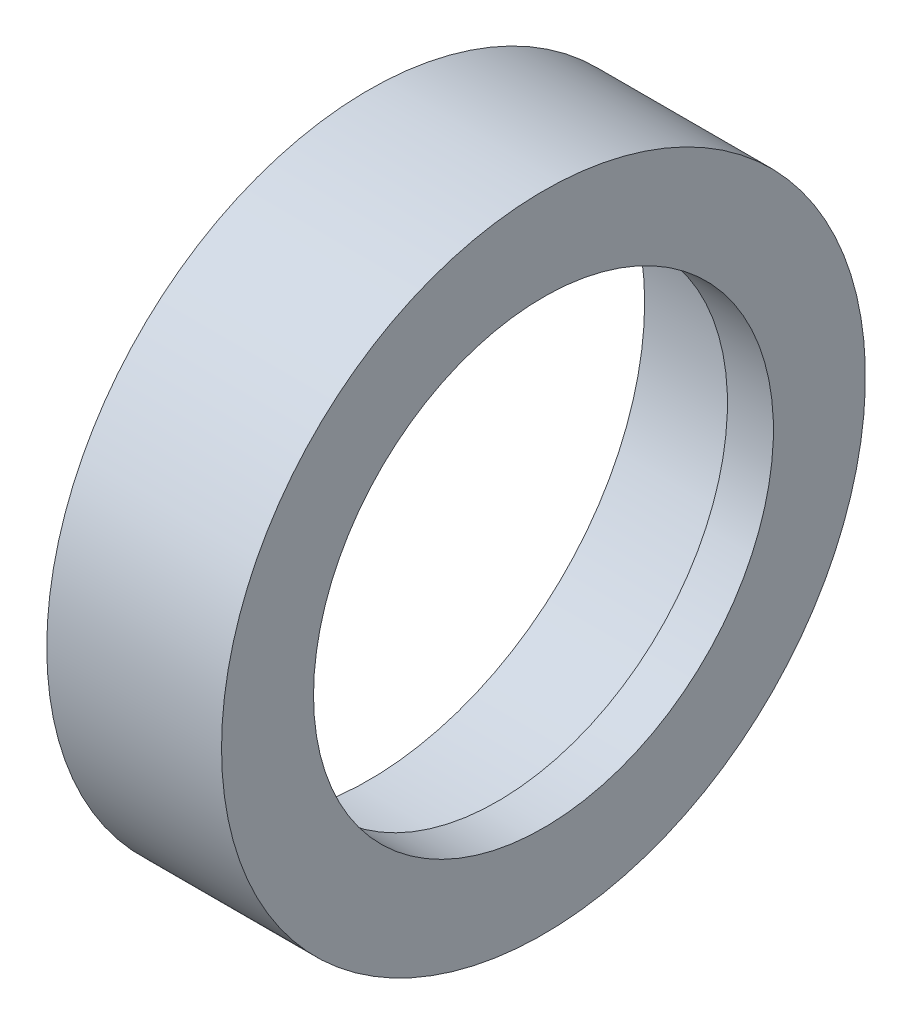
ISO-10303-21;
HEADER;
FILE_DESCRIPTION(('STEP AP214'),'2;1');
FILE_NAME('part.step','',(''),(''),'','','');
FILE_SCHEMA(('AUTOMOTIVE_DESIGN { 1 0 10303 214 1 1 1 1 }'));
ENDSEC;
DATA;
#1=APPLICATION_CONTEXT('core data for automotive mechanical design processes');
#2=APPLICATION_PROTOCOL_DEFINITION('international standard','automotive_design',2000,#1);
#3=PRODUCT_CONTEXT('',#1,'mechanical');
#4=PRODUCT('Part','Part','',(#3));
#5=PRODUCT_RELATED_PRODUCT_CATEGORY('part','',(#4));
#6=PRODUCT_DEFINITION_FORMATION('','',#4);
#7=PRODUCT_DEFINITION_CONTEXT('part definition',#1,'design');
#8=PRODUCT_DEFINITION('design','',#6,#7);
#9=PRODUCT_DEFINITION_SHAPE('','',#8);
#10=(LENGTH_UNIT() NAMED_UNIT(*) SI_UNIT(.MILLI.,.METRE.));
#11=(NAMED_UNIT(*) PLANE_ANGLE_UNIT() SI_UNIT($,.RADIAN.));
#12=(NAMED_UNIT(*) SI_UNIT($,.STERADIAN.) SOLID_ANGLE_UNIT());
#13=UNCERTAINTY_MEASURE_WITH_UNIT(LENGTH_MEASURE(1.E-05),#10,'distance_accuracy_value','');
#14=(GEOMETRIC_REPRESENTATION_CONTEXT(3) GLOBAL_UNCERTAINTY_ASSIGNED_CONTEXT((#13)) GLOBAL_UNIT_ASSIGNED_CONTEXT((#10,
#11,#12)) REPRESENTATION_CONTEXT('',''));
#15=CARTESIAN_POINT('',(0.,0.,0.));
#16=DIRECTION('',(0.,0.,1.));
#17=DIRECTION('',(1.,0.,0.));
#18=AXIS2_PLACEMENT_3D('',#15,#16,#17);
#19=CARTESIAN_POINT('',(-15.3726629670044,0.,0.));
#20=DIRECTION('',(-1.,0.,0.));
#21=DIRECTION('',(0.,0.,1.));
#22=AXIS2_PLACEMENT_3D('',#19,#20,#21);
#23=CYLINDRICAL_SURFACE('',#22,35.);
#24=CARTESIAN_POINT('',(-19.,0.,0.));
#25=DIRECTION('',(-1.,0.,0.));
#26=DIRECTION('',(0.,0.,1.));
#27=AXIS2_PLACEMENT_3D('',#24,#25,#26);
#28=CIRCLE('',#27,35.);
#29=CARTESIAN_POINT('',(-19.,0.,35.));
#30=VERTEX_POINT('',#29);
#31=EDGE_CURVE('E10',#30,#30,#28,.T.);
#32=ORIENTED_EDGE('',*,*,#31,.F.);
#33=EDGE_LOOP('',(#32));
#34=FACE_BOUND('',#33,.T.);
#35=CARTESIAN_POINT('',(0.,0.,0.));
#36=DIRECTION('',(-1.,0.,0.));
#37=DIRECTION('',(0.,0.,1.));
#38=AXIS2_PLACEMENT_3D('',#35,#36,#37);
#39=CIRCLE('',#38,35.);
#40=CARTESIAN_POINT('',(0.,0.,35.));
#41=VERTEX_POINT('',#40);
#42=EDGE_CURVE('E53',#41,#41,#39,.T.);
#43=ORIENTED_EDGE('',*,*,#42,.T.);
#44=EDGE_LOOP('',(#43));
#45=FACE_BOUND('',#44,.T.);
#46=ADVANCED_FACE('F31',(#34,#45),#23,.T.);
#47=CARTESIAN_POINT('',(-19.,35.,0.));
#48=DIRECTION('',(1.,0.,0.));
#49=DIRECTION('',(0.,0.,-1.));
#50=AXIS2_PLACEMENT_3D('',#47,#48,#49);
#51=PLANE('',#50);
#52=CARTESIAN_POINT('',(-19.,0.,0.));
#53=DIRECTION('',(-1.,0.,0.));
#54=DIRECTION('',(0.,0.,1.));
#55=AXIS2_PLACEMENT_3D('',#52,#53,#54);
#56=CIRCLE('',#55,30.);
#57=CARTESIAN_POINT('',(-19.,0.,30.));
#58=VERTEX_POINT('',#57);
#59=EDGE_CURVE('E37',#58,#58,#56,.T.);
#60=ORIENTED_EDGE('',*,*,#59,.F.);
#61=EDGE_LOOP('',(#60));
#62=FACE_BOUND('',#61,.T.);
#63=ORIENTED_EDGE('',*,*,#31,.T.);
#64=EDGE_LOOP('',(#63));
#65=FACE_BOUND('',#64,.T.);
#66=ADVANCED_FACE('F78',(#62,#65),#51,.F.);
#67=CARTESIAN_POINT('',(-15.3726629670044,0.,0.));
#68=DIRECTION('',(-1.,0.,0.));
#69=DIRECTION('',(0.,0.,1.));
#70=AXIS2_PLACEMENT_3D('',#67,#68,#69);
#71=CYLINDRICAL_SURFACE('',#70,30.);
#72=CARTESIAN_POINT('',(-5.,0.,0.));
#73=DIRECTION('',(-1.,0.,0.));
#74=DIRECTION('',(0.,0.,1.));
#75=AXIS2_PLACEMENT_3D('',#72,#73,#74);
#76=CIRCLE('',#75,30.);
#77=CARTESIAN_POINT('',(-5.,0.,30.));
#78=VERTEX_POINT('',#77);
#79=EDGE_CURVE('E41',#78,#78,#76,.T.);
#80=ORIENTED_EDGE('',*,*,#79,.F.);
#81=EDGE_LOOP('',(#80));
#82=FACE_BOUND('',#81,.T.);
#83=ORIENTED_EDGE('',*,*,#59,.T.);
#84=EDGE_LOOP('',(#83));
#85=FACE_BOUND('',#84,.T.);
#86=ADVANCED_FACE('F73',(#82,#85),#71,.F.);
#87=CARTESIAN_POINT('',(-5.,30.,0.));
#88=DIRECTION('',(1.,0.,0.));
#89=DIRECTION('',(0.,0.,-1.));
#90=AXIS2_PLACEMENT_3D('',#87,#88,#89);
#91=PLANE('',#90);
#92=CARTESIAN_POINT('',(-5.,0.,0.));
#93=DIRECTION('',(-1.,0.,0.));
#94=DIRECTION('',(0.,0.,1.));
#95=AXIS2_PLACEMENT_3D('',#92,#93,#94);
#96=CIRCLE('',#95,25.);
#97=CARTESIAN_POINT('',(-5.,0.,25.));
#98=VERTEX_POINT('',#97);
#99=EDGE_CURVE('E45',#98,#98,#96,.T.);
#100=ORIENTED_EDGE('',*,*,#99,.F.);
#101=EDGE_LOOP('',(#100));
#102=FACE_BOUND('',#101,.T.);
#103=ORIENTED_EDGE('',*,*,#79,.T.);
#104=EDGE_LOOP('',(#103));
#105=FACE_BOUND('',#104,.T.);
#106=ADVANCED_FACE('F67',(#102,#105),#91,.F.);
#107=CARTESIAN_POINT('',(-15.3726629670044,0.,0.));
#108=DIRECTION('',(-1.,0.,0.));
#109=DIRECTION('',(0.,0.,1.));
#110=AXIS2_PLACEMENT_3D('',#107,#108,#109);
#111=CYLINDRICAL_SURFACE('',#110,25.);
#112=CARTESIAN_POINT('',(0.,0.,0.));
#113=DIRECTION('',(-1.,0.,0.));
#114=DIRECTION('',(0.,0.,1.));
#115=AXIS2_PLACEMENT_3D('',#112,#113,#114);
#116=CIRCLE('',#115,25.);
#117=CARTESIAN_POINT('',(0.,0.,25.));
#118=VERTEX_POINT('',#117);
#119=EDGE_CURVE('E50',#118,#118,#116,.T.);
#120=ORIENTED_EDGE('',*,*,#119,.F.);
#121=EDGE_LOOP('',(#120));
#122=FACE_BOUND('',#121,.T.);
#123=ORIENTED_EDGE('',*,*,#99,.T.);
#124=EDGE_LOOP('',(#123));
#125=FACE_BOUND('',#124,.T.);
#126=ADVANCED_FACE('F61',(#122,#125),#111,.F.);
#127=CARTESIAN_POINT('',(0.,25.,0.));
#128=DIRECTION('',(-1.,0.,0.));
#129=DIRECTION('',(0.,0.,1.));
#130=AXIS2_PLACEMENT_3D('',#127,#128,#129);
#131=PLANE('',#130);
#132=ORIENTED_EDGE('',*,*,#42,.F.);
#133=EDGE_LOOP('',(#132));
#134=FACE_BOUND('',#133,.T.);
#135=ORIENTED_EDGE('',*,*,#119,.T.);
#136=EDGE_LOOP('',(#135));
#137=FACE_BOUND('',#136,.T.);
#138=ADVANCED_FACE('F58',(#134,#137),#131,.F.);
#139=CLOSED_SHELL('',(#46,#66,#86,#106,#126,#138));
#140=MANIFOLD_SOLID_BREP('B2',#139);
#141=ADVANCED_BREP_SHAPE_REPRESENTATION('',(#18,#140),#14);
#142=SHAPE_DEFINITION_REPRESENTATION(#9,#141);
ENDSEC;
END-ISO-10303-21;
